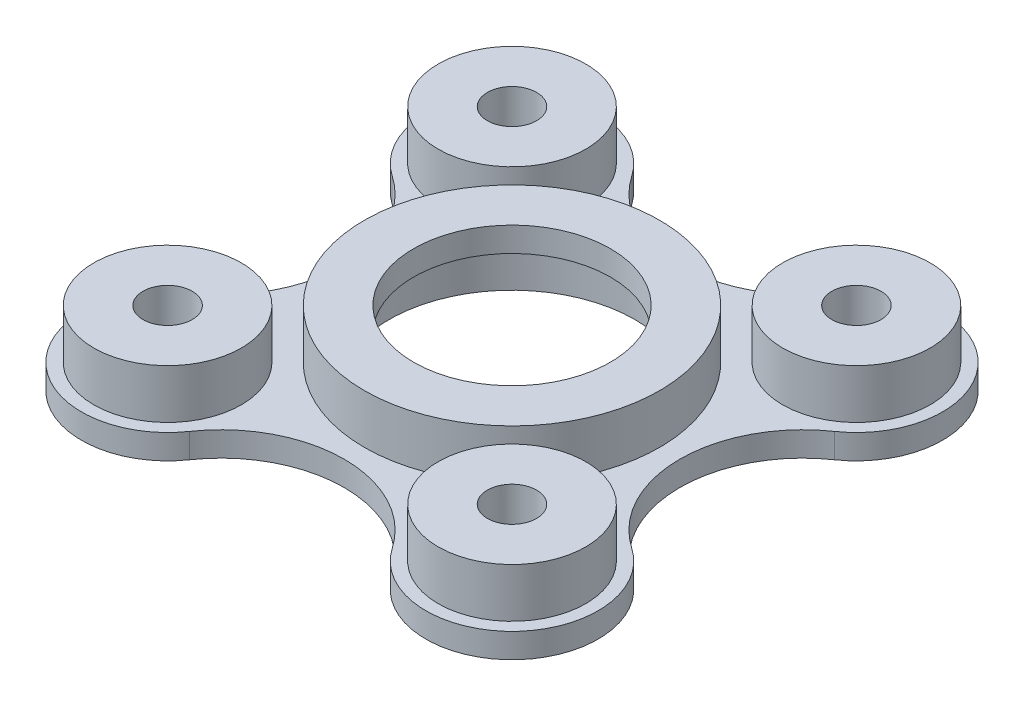
ISO-10303-21;
HEADER;
FILE_DESCRIPTION(('STEP AP214'),'2;1');
FILE_NAME('part.step','',(''),(''),'','','');
FILE_SCHEMA(('AUTOMOTIVE_DESIGN { 1 0 10303 214 1 1 1 1 }'));
ENDSEC;
DATA;
#1=APPLICATION_CONTEXT('core data for automotive mechanical design processes');
#2=APPLICATION_PROTOCOL_DEFINITION('international standard','automotive_design',2000,#1);
#3=PRODUCT_CONTEXT('',#1,'mechanical');
#4=PRODUCT('Part','Part','',(#3));
#5=PRODUCT_RELATED_PRODUCT_CATEGORY('part','',(#4));
#6=PRODUCT_DEFINITION_FORMATION('','',#4);
#7=PRODUCT_DEFINITION_CONTEXT('part definition',#1,'design');
#8=PRODUCT_DEFINITION('design','',#6,#7);
#9=PRODUCT_DEFINITION_SHAPE('','',#8);
#10=(LENGTH_UNIT() NAMED_UNIT(*) SI_UNIT(.MILLI.,.METRE.));
#11=(NAMED_UNIT(*) PLANE_ANGLE_UNIT() SI_UNIT($,.RADIAN.));
#12=(NAMED_UNIT(*) SI_UNIT($,.STERADIAN.) SOLID_ANGLE_UNIT());
#13=UNCERTAINTY_MEASURE_WITH_UNIT(LENGTH_MEASURE(1.E-05),#10,'distance_accuracy_value','');
#14=(GEOMETRIC_REPRESENTATION_CONTEXT(3) GLOBAL_UNCERTAINTY_ASSIGNED_CONTEXT((#13)) GLOBAL_UNIT_ASSIGNED_CONTEXT((#10,
#11,#12)) REPRESENTATION_CONTEXT('',''));
#15=CARTESIAN_POINT('',(0.,0.,0.));
#16=DIRECTION('',(0.,0.,1.));
#17=DIRECTION('',(1.,0.,0.));
#18=AXIS2_PLACEMENT_3D('',#15,#16,#17);
#19=CARTESIAN_POINT('',(0.,1.,0.));
#20=DIRECTION('',(0.,1.,0.));
#21=DIRECTION('',(0.,0.,1.));
#22=AXIS2_PLACEMENT_3D('',#19,#20,#21);
#23=PLANE('',#22);
#24=CARTESIAN_POINT('',(7.00000000000045,1.,6.99999999999936));
#25=DIRECTION('',(0.,1.,0.));
#26=DIRECTION('',(0.,0.,1.));
#27=AXIS2_PLACEMENT_3D('',#24,#25,#26);
#28=CIRCLE('',#27,3.);
#29=CARTESIAN_POINT('',(7.00000000000045,1.,9.99999999999936));
#30=VERTEX_POINT('',#29);
#31=EDGE_CURVE('E229',#30,#30,#28,.T.);
#32=ORIENTED_EDGE('',*,*,#31,.F.);
#33=EDGE_LOOP('',(#32));
#34=FACE_BOUND('',#33,.T.);
#35=CARTESIAN_POINT('',(-7.,1.,-7.00000000000002));
#36=DIRECTION('',(0.,1.,0.));
#37=DIRECTION('',(0.,0.,1.));
#38=AXIS2_PLACEMENT_3D('',#35,#36,#37);
#39=CIRCLE('',#38,3.);
#40=CARTESIAN_POINT('',(-7.,1.,-4.00000000000002));
#41=VERTEX_POINT('',#40);
#42=EDGE_CURVE('E217',#41,#41,#39,.T.);
#43=ORIENTED_EDGE('',*,*,#42,.F.);
#44=EDGE_LOOP('',(#43));
#45=FACE_BOUND('',#44,.T.);
#46=CARTESIAN_POINT('',(11.8218253804959,1.,-3.27701990622173E-13));
#47=DIRECTION('',(0.,1.,0.));
#48=DIRECTION('',(0.,0.,1.));
#49=AXIS2_PLACEMENT_3D('',#46,#47,#48);
#50=CIRCLE('',#49,4.99999999999962);
#51=CARTESIAN_POINT('',(8.98545750961605,1.,-4.1176470588239));
#52=VERTEX_POINT('',#51);
#53=CARTESIAN_POINT('',(8.98545750961618,1.,4.11764705882295));
#54=VERTEX_POINT('',#53);
#55=EDGE_CURVE('E166',#52,#54,#50,.T.);
#56=ORIENTED_EDGE('',*,*,#55,.F.);
#57=CARTESIAN_POINT('',(6.99999999999996,1.,-7.00000000000051));
#58=DIRECTION('',(0.,1.,0.));
#59=DIRECTION('',(0.,0.,1.));
#60=AXIS2_PLACEMENT_3D('',#57,#58,#59);
#61=CIRCLE('',#60,3.50000000000006);
#62=CARTESIAN_POINT('',(4.11764705882321,1.,-8.9854575096164));
#63=VERTEX_POINT('',#62);
#64=EDGE_CURVE('E194',#52,#63,#61,.T.);
#65=ORIENTED_EDGE('',*,*,#64,.T.);
#66=CARTESIAN_POINT('',(-1.16403269125734E-13,1.,-11.821825380496));
#67=DIRECTION('',(0.,1.,0.));
#68=DIRECTION('',(0.,0.,1.));
#69=AXIS2_PLACEMENT_3D('',#66,#67,#68);
#70=CIRCLE('',#69,4.99999999999949);
#71=CARTESIAN_POINT('',(-4.11764705882334,1.,-8.98545750961605));
#72=VERTEX_POINT('',#71);
#73=EDGE_CURVE('E179',#72,#63,#70,.T.);
#74=ORIENTED_EDGE('',*,*,#73,.F.);
#75=CARTESIAN_POINT('',(-7.,1.,-7.00000000000002));
#76=DIRECTION('',(0.,1.,0.));
#77=DIRECTION('',(0.,0.,1.));
#78=AXIS2_PLACEMENT_3D('',#75,#76,#77);
#79=CIRCLE('',#78,3.50000000000006);
#80=CARTESIAN_POINT('',(-8.98545750961589,1.,-4.11764705882327));
#81=VERTEX_POINT('',#80);
#82=EDGE_CURVE('E192',#72,#81,#79,.T.);
#83=ORIENTED_EDGE('',*,*,#82,.T.);
#84=CARTESIAN_POINT('',(-11.8218253804954,1.,1.25893673085622E-13));
#85=DIRECTION('',(0.,1.,0.));
#86=DIRECTION('',(0.,0.,1.));
#87=AXIS2_PLACEMENT_3D('',#84,#85,#86);
#88=CIRCLE('',#87,4.99999999999941);
#89=CARTESIAN_POINT('',(-8.98545750961566,1.,4.11764705882323));
#90=VERTEX_POINT('',#89);
#91=EDGE_CURVE('E112',#90,#81,#88,.T.);
#92=ORIENTED_EDGE('',*,*,#91,.F.);
#93=CARTESIAN_POINT('',(-6.99999999999951,1.,6.99999999999994));
#94=DIRECTION('',(0.,1.,0.));
#95=DIRECTION('',(0.,0.,1.));
#96=AXIS2_PLACEMENT_3D('',#93,#94,#95);
#97=CIRCLE('',#96,3.50000000000017);
#98=CARTESIAN_POINT('',(-4.11764705882275,1.,8.985457509616));
#99=VERTEX_POINT('',#98);
#100=EDGE_CURVE('E106',#90,#99,#97,.T.);
#101=ORIENTED_EDGE('',*,*,#100,.T.);
#102=CARTESIAN_POINT('',(5.10229450965904E-13,1.,11.8218253804956));
#103=DIRECTION('',(0.,1.,0.));
#104=DIRECTION('',(0.,0.,1.));
#105=AXIS2_PLACEMENT_3D('',#102,#103,#104);
#106=CIRCLE('',#105,4.99999999999951);
#107=CARTESIAN_POINT('',(4.11764705882381,1.,8.98545750961555));
#108=VERTEX_POINT('',#107);
#109=EDGE_CURVE('E110',#108,#99,#106,.T.);
#110=ORIENTED_EDGE('',*,*,#109,.F.);
#111=CARTESIAN_POINT('',(7.00000000000039,1.,6.99999999999963));
#112=DIRECTION('',(0.,1.,0.));
#113=DIRECTION('',(0.,0.,1.));
#114=AXIS2_PLACEMENT_3D('',#111,#112,#113);
#115=CIRCLE('',#114,3.49999999999994);
#116=EDGE_CURVE('E53',#108,#54,#115,.T.);
#117=ORIENTED_EDGE('',*,*,#116,.T.);
#118=EDGE_LOOP('',(#56,#65,#74,#83,#92,#101,#110,#117));
#119=FACE_BOUND('',#118,.T.);
#120=CARTESIAN_POINT('',(0.,1.,0.));
#121=DIRECTION('',(0.,1.,0.));
#122=DIRECTION('',(0.,0.,1.));
#123=AXIS2_PLACEMENT_3D('',#120,#121,#122);
#124=CIRCLE('',#123,6.);
#125=CARTESIAN_POINT('',(0.,1.,6.));
#126=VERTEX_POINT('',#125);
#127=EDGE_CURVE('E202',#126,#126,#124,.T.);
#128=ORIENTED_EDGE('',*,*,#127,.F.);
#129=EDGE_LOOP('',(#128));
#130=FACE_BOUND('',#129,.T.);
#131=CARTESIAN_POINT('',(7.00000000000002,1.,-7.0000000000006));
#132=DIRECTION('',(0.,1.,0.));
#133=DIRECTION('',(0.,0.,1.));
#134=AXIS2_PLACEMENT_3D('',#131,#132,#133);
#135=CIRCLE('',#134,3.);
#136=CARTESIAN_POINT('',(7.00000000000002,1.,-4.0000000000006));
#137=VERTEX_POINT('',#136);
#138=EDGE_CURVE('E223',#137,#137,#135,.T.);
#139=ORIENTED_EDGE('',*,*,#138,.F.);
#140=EDGE_LOOP('',(#139));
#141=FACE_BOUND('',#140,.T.);
#142=CARTESIAN_POINT('',(-6.99999999999957,1.,6.99999999999994));
#143=DIRECTION('',(0.,1.,0.));
#144=DIRECTION('',(0.,0.,1.));
#145=AXIS2_PLACEMENT_3D('',#142,#143,#144);
#146=CIRCLE('',#145,3.);
#147=CARTESIAN_POINT('',(-6.99999999999957,1.,9.99999999999994));
#148=VERTEX_POINT('',#147);
#149=EDGE_CURVE('E235',#148,#148,#146,.T.);
#150=ORIENTED_EDGE('',*,*,#149,.F.);
#151=EDGE_LOOP('',(#150));
#152=FACE_BOUND('',#151,.T.);
#153=ADVANCED_FACE('F36',(#34,#45,#119,#130,#141,#152),#23,.T.);
#154=CARTESIAN_POINT('',(11.8218253804959,1.,-3.27701990622173E-13));
#155=DIRECTION('',(0.,-1.,0.));
#156=DIRECTION('',(0.,0.,-1.));
#157=AXIS2_PLACEMENT_3D('',#154,#155,#156);
#158=CYLINDRICAL_SURFACE('',#157,4.99999999999962);
#159=CARTESIAN_POINT('',(11.8218253804959,0.,-3.27701990622173E-13));
#160=DIRECTION('',(0.,1.,0.));
#161=DIRECTION('',(0.,0.,1.));
#162=AXIS2_PLACEMENT_3D('',#159,#160,#161);
#163=CIRCLE('',#162,4.99999999999962);
#164=CARTESIAN_POINT('',(8.98545750961605,0.,-4.1176470588239));
#165=VERTEX_POINT('',#164);
#166=CARTESIAN_POINT('',(8.98545750961618,0.,4.11764705882295));
#167=VERTEX_POINT('',#166);
#168=EDGE_CURVE('E130',#165,#167,#163,.T.);
#169=ORIENTED_EDGE('',*,*,#168,.F.);
#170=DIRECTION('',(0.,-1.,0.));
#171=VECTOR('',#170,1.);
#172=CARTESIAN_POINT('',(8.98545750961605,1.,-4.1176470588239));
#173=LINE('',#172,#171);
#174=EDGE_CURVE('E11',#52,#165,#173,.T.);
#175=ORIENTED_EDGE('',*,*,#174,.F.);
#176=ORIENTED_EDGE('',*,*,#55,.T.);
#177=DIRECTION('',(0.,-1.,0.));
#178=VECTOR('',#177,1.);
#179=CARTESIAN_POINT('',(8.98545750961618,1.,4.11764705882295));
#180=LINE('',#179,#178);
#181=EDGE_CURVE('E87',#54,#167,#180,.T.);
#182=ORIENTED_EDGE('',*,*,#181,.T.);
#183=EDGE_LOOP('',(#169,#175,#176,#182));
#184=FACE_BOUND('',#183,.T.);
#185=ADVANCED_FACE('F38',(#184),#158,.F.);
#186=CARTESIAN_POINT('',(6.99999999999996,1.,-7.00000000000051));
#187=DIRECTION('',(0.,-1.,0.));
#188=DIRECTION('',(0.,0.,-1.));
#189=AXIS2_PLACEMENT_3D('',#186,#187,#188);
#190=CYLINDRICAL_SURFACE('',#189,3.50000000000006);
#191=CARTESIAN_POINT('',(6.99999999999996,0.,-7.00000000000051));
#192=DIRECTION('',(0.,1.,0.));
#193=DIRECTION('',(0.,0.,1.));
#194=AXIS2_PLACEMENT_3D('',#191,#192,#193);
#195=CIRCLE('',#194,3.50000000000006);
#196=CARTESIAN_POINT('',(4.11764705882321,0.,-8.9854575096164));
#197=VERTEX_POINT('',#196);
#198=EDGE_CURVE('E133',#165,#197,#195,.T.);
#199=ORIENTED_EDGE('',*,*,#198,.T.);
#200=DIRECTION('',(0.,-1.,0.));
#201=VECTOR('',#200,1.);
#202=CARTESIAN_POINT('',(4.11764705882321,1.,-8.9854575096164));
#203=LINE('',#202,#201);
#204=EDGE_CURVE('E45',#63,#197,#203,.T.);
#205=ORIENTED_EDGE('',*,*,#204,.F.);
#206=ORIENTED_EDGE('',*,*,#64,.F.);
#207=ORIENTED_EDGE('',*,*,#174,.T.);
#208=EDGE_LOOP('',(#199,#205,#206,#207));
#209=FACE_BOUND('',#208,.T.);
#210=ADVANCED_FACE('F182',(#209),#190,.T.);
#211=CARTESIAN_POINT('',(-1.16403269125734E-13,1.,-11.821825380496));
#212=DIRECTION('',(0.,-1.,0.));
#213=DIRECTION('',(0.,0.,-1.));
#214=AXIS2_PLACEMENT_3D('',#211,#212,#213);
#215=CYLINDRICAL_SURFACE('',#214,4.99999999999949);
#216=CARTESIAN_POINT('',(-1.16403269125734E-13,0.,-11.821825380496));
#217=DIRECTION('',(0.,1.,0.));
#218=DIRECTION('',(0.,0.,1.));
#219=AXIS2_PLACEMENT_3D('',#216,#217,#218);
#220=CIRCLE('',#219,4.99999999999949);
#221=CARTESIAN_POINT('',(-4.11764705882334,0.,-8.98545750961605));
#222=VERTEX_POINT('',#221);
#223=EDGE_CURVE('E137',#222,#197,#220,.T.);
#224=ORIENTED_EDGE('',*,*,#223,.F.);
#225=DIRECTION('',(0.,-1.,0.));
#226=VECTOR('',#225,1.);
#227=CARTESIAN_POINT('',(-4.11764705882334,1.,-8.98545750961605));
#228=LINE('',#227,#226);
#229=EDGE_CURVE('E172',#72,#222,#228,.T.);
#230=ORIENTED_EDGE('',*,*,#229,.F.);
#231=ORIENTED_EDGE('',*,*,#73,.T.);
#232=ORIENTED_EDGE('',*,*,#204,.T.);
#233=EDGE_LOOP('',(#224,#230,#231,#232));
#234=FACE_BOUND('',#233,.T.);
#235=ADVANCED_FACE('F177',(#234),#215,.F.);
#236=CARTESIAN_POINT('',(-7.,1.,-7.00000000000002));
#237=DIRECTION('',(0.,-1.,0.));
#238=DIRECTION('',(0.,0.,-1.));
#239=AXIS2_PLACEMENT_3D('',#236,#237,#238);
#240=CYLINDRICAL_SURFACE('',#239,3.50000000000006);
#241=CARTESIAN_POINT('',(-7.,0.,-7.00000000000002));
#242=DIRECTION('',(0.,1.,0.));
#243=DIRECTION('',(0.,0.,1.));
#244=AXIS2_PLACEMENT_3D('',#241,#242,#243);
#245=CIRCLE('',#244,3.50000000000006);
#246=CARTESIAN_POINT('',(-8.98545750961589,0.,-4.11764705882327));
#247=VERTEX_POINT('',#246);
#248=EDGE_CURVE('E140',#222,#247,#245,.T.);
#249=ORIENTED_EDGE('',*,*,#248,.T.);
#250=DIRECTION('',(0.,-1.,0.));
#251=VECTOR('',#250,1.);
#252=CARTESIAN_POINT('',(-8.98545750961589,1.,-4.11764705882327));
#253=LINE('',#252,#251);
#254=EDGE_CURVE('E170',#81,#247,#253,.T.);
#255=ORIENTED_EDGE('',*,*,#254,.F.);
#256=ORIENTED_EDGE('',*,*,#82,.F.);
#257=ORIENTED_EDGE('',*,*,#229,.T.);
#258=EDGE_LOOP('',(#249,#255,#256,#257));
#259=FACE_BOUND('',#258,.T.);
#260=ADVANCED_FACE('F190',(#259),#240,.T.);
#261=CARTESIAN_POINT('',(-11.8218253804954,1.,1.25893673085622E-13));
#262=DIRECTION('',(0.,-1.,0.));
#263=DIRECTION('',(0.,0.,-1.));
#264=AXIS2_PLACEMENT_3D('',#261,#262,#263);
#265=CYLINDRICAL_SURFACE('',#264,4.99999999999941);
#266=CARTESIAN_POINT('',(-11.8218253804954,0.,1.25893673085622E-13));
#267=DIRECTION('',(0.,1.,0.));
#268=DIRECTION('',(0.,0.,1.));
#269=AXIS2_PLACEMENT_3D('',#266,#267,#268);
#270=CIRCLE('',#269,4.99999999999941);
#271=CARTESIAN_POINT('',(-8.98545750961566,0.,4.11764705882323));
#272=VERTEX_POINT('',#271);
#273=EDGE_CURVE('E143',#272,#247,#270,.T.);
#274=ORIENTED_EDGE('',*,*,#273,.F.);
#275=DIRECTION('',(0.,-1.,0.));
#276=VECTOR('',#275,1.);
#277=CARTESIAN_POINT('',(-8.98545750961566,1.,4.11764705882323));
#278=LINE('',#277,#276);
#279=EDGE_CURVE('E123',#90,#272,#278,.T.);
#280=ORIENTED_EDGE('',*,*,#279,.F.);
#281=ORIENTED_EDGE('',*,*,#91,.T.);
#282=ORIENTED_EDGE('',*,*,#254,.T.);
#283=EDGE_LOOP('',(#274,#280,#281,#282));
#284=FACE_BOUND('',#283,.T.);
#285=ADVANCED_FACE('F199',(#284),#265,.F.);
#286=CARTESIAN_POINT('',(-6.99999999999951,1.,6.99999999999994));
#287=DIRECTION('',(0.,-1.,0.));
#288=DIRECTION('',(0.,0.,-1.));
#289=AXIS2_PLACEMENT_3D('',#286,#287,#288);
#290=CYLINDRICAL_SURFACE('',#289,3.50000000000017);
#291=CARTESIAN_POINT('',(-6.99999999999951,0.,6.99999999999994));
#292=DIRECTION('',(0.,1.,0.));
#293=DIRECTION('',(0.,0.,1.));
#294=AXIS2_PLACEMENT_3D('',#291,#292,#293);
#295=CIRCLE('',#294,3.50000000000017);
#296=CARTESIAN_POINT('',(-4.11764705882275,0.,8.985457509616));
#297=VERTEX_POINT('',#296);
#298=EDGE_CURVE('E119',#272,#297,#295,.T.);
#299=ORIENTED_EDGE('',*,*,#298,.T.);
#300=DIRECTION('',(0.,-1.,0.));
#301=VECTOR('',#300,1.);
#302=CARTESIAN_POINT('',(-4.11764705882275,1.,8.985457509616));
#303=LINE('',#302,#301);
#304=EDGE_CURVE('E116',#99,#297,#303,.T.);
#305=ORIENTED_EDGE('',*,*,#304,.F.);
#306=ORIENTED_EDGE('',*,*,#100,.F.);
#307=ORIENTED_EDGE('',*,*,#279,.T.);
#308=EDGE_LOOP('',(#299,#305,#306,#307));
#309=FACE_BOUND('',#308,.T.);
#310=ADVANCED_FACE('F117',(#309),#290,.T.);
#311=CARTESIAN_POINT('',(5.10229450965904E-13,1.,11.8218253804956));
#312=DIRECTION('',(0.,-1.,0.));
#313=DIRECTION('',(0.,0.,-1.));
#314=AXIS2_PLACEMENT_3D('',#311,#312,#313);
#315=CYLINDRICAL_SURFACE('',#314,4.99999999999951);
#316=CARTESIAN_POINT('',(5.10229450965904E-13,0.,11.8218253804956));
#317=DIRECTION('',(0.,1.,0.));
#318=DIRECTION('',(0.,0.,1.));
#319=AXIS2_PLACEMENT_3D('',#316,#317,#318);
#320=CIRCLE('',#319,4.99999999999951);
#321=CARTESIAN_POINT('',(4.11764705882381,0.,8.98545750961555));
#322=VERTEX_POINT('',#321);
#323=EDGE_CURVE('E147',#322,#297,#320,.T.);
#324=ORIENTED_EDGE('',*,*,#323,.F.);
#325=DIRECTION('',(0.,-1.,0.));
#326=VECTOR('',#325,1.);
#327=CARTESIAN_POINT('',(4.11764705882381,1.,8.98545750961555));
#328=LINE('',#327,#326);
#329=EDGE_CURVE('E80',#108,#322,#328,.T.);
#330=ORIENTED_EDGE('',*,*,#329,.F.);
#331=ORIENTED_EDGE('',*,*,#109,.T.);
#332=ORIENTED_EDGE('',*,*,#304,.T.);
#333=EDGE_LOOP('',(#324,#330,#331,#332));
#334=FACE_BOUND('',#333,.T.);
#335=ADVANCED_FACE('F125',(#334),#315,.F.);
#336=CARTESIAN_POINT('',(-7.,1.,-7.00000000000002));
#337=DIRECTION('',(0.,-1.,0.));
#338=DIRECTION('',(0.,0.,-1.));
#339=AXIS2_PLACEMENT_3D('',#336,#337,#338);
#340=CYLINDRICAL_SURFACE('',#339,0.999999999999998);
#341=CARTESIAN_POINT('',(-7.,0.,-7.00000000000002));
#342=DIRECTION('',(0.,1.,0.));
#343=DIRECTION('',(0.,0.,1.));
#344=AXIS2_PLACEMENT_3D('',#341,#342,#343);
#345=CIRCLE('',#344,0.999999999999998);
#346=CARTESIAN_POINT('',(-7.,0.,-6.00000000000002));
#347=VERTEX_POINT('',#346);
#348=EDGE_CURVE('E160',#347,#347,#345,.T.);
#349=ORIENTED_EDGE('',*,*,#348,.F.);
#350=EDGE_LOOP('',(#349));
#351=FACE_BOUND('',#350,.T.);
#352=CARTESIAN_POINT('',(-7.,3.,-7.00000000000002));
#353=DIRECTION('',(0.,-1.,0.));
#354=DIRECTION('',(0.,0.,-1.));
#355=AXIS2_PLACEMENT_3D('',#352,#353,#354);
#356=CIRCLE('',#355,1.);
#357=CARTESIAN_POINT('',(-7.,3.,-8.00000000000002));
#358=VERTEX_POINT('',#357);
#359=EDGE_CURVE('E249',#358,#358,#356,.T.);
#360=ORIENTED_EDGE('',*,*,#359,.F.);
#361=EDGE_LOOP('',(#360));
#362=FACE_BOUND('',#361,.T.);
#363=ADVANCED_FACE('F256',(#351,#362),#340,.F.);
#364=CARTESIAN_POINT('',(7.00000000000002,1.,-7.0000000000006));
#365=DIRECTION('',(0.,-1.,0.));
#366=DIRECTION('',(0.,0.,-1.));
#367=AXIS2_PLACEMENT_3D('',#364,#365,#366);
#368=CYLINDRICAL_SURFACE('',#367,1.);
#369=CARTESIAN_POINT('',(7.00000000000002,0.,-7.0000000000006));
#370=DIRECTION('',(0.,1.,0.));
#371=DIRECTION('',(0.,0.,1.));
#372=AXIS2_PLACEMENT_3D('',#369,#370,#371);
#373=CIRCLE('',#372,1.);
#374=CARTESIAN_POINT('',(7.00000000000002,0.,-6.0000000000006));
#375=VERTEX_POINT('',#374);
#376=EDGE_CURVE('E157',#375,#375,#373,.T.);
#377=ORIENTED_EDGE('',*,*,#376,.F.);
#378=EDGE_LOOP('',(#377));
#379=FACE_BOUND('',#378,.T.);
#380=CARTESIAN_POINT('',(7.00000000000002,3.,-7.00000000000061));
#381=DIRECTION('',(0.,-1.,0.));
#382=DIRECTION('',(0.,0.,-1.));
#383=AXIS2_PLACEMENT_3D('',#380,#381,#382);
#384=CIRCLE('',#383,1.);
#385=CARTESIAN_POINT('',(7.00000000000002,3.,-8.00000000000061));
#386=VERTEX_POINT('',#385);
#387=EDGE_CURVE('E246',#386,#386,#384,.T.);
#388=ORIENTED_EDGE('',*,*,#387,.F.);
#389=EDGE_LOOP('',(#388));
#390=FACE_BOUND('',#389,.T.);
#391=ADVANCED_FACE('F258',(#379,#390),#368,.F.);
#392=CARTESIAN_POINT('',(7.0000000000006,1.,6.99999999999942));
#393=DIRECTION('',(0.,-1.,0.));
#394=DIRECTION('',(0.,0.,-1.));
#395=AXIS2_PLACEMENT_3D('',#392,#393,#394);
#396=CYLINDRICAL_SURFACE('',#395,1.);
#397=CARTESIAN_POINT('',(7.0000000000006,0.,6.99999999999942));
#398=DIRECTION('',(0.,1.,0.));
#399=DIRECTION('',(0.,0.,1.));
#400=AXIS2_PLACEMENT_3D('',#397,#398,#399);
#401=CIRCLE('',#400,1.);
#402=CARTESIAN_POINT('',(7.0000000000006,0.,7.99999999999942));
#403=VERTEX_POINT('',#402);
#404=EDGE_CURVE('E154',#403,#403,#401,.T.);
#405=ORIENTED_EDGE('',*,*,#404,.F.);
#406=EDGE_LOOP('',(#405));
#407=FACE_BOUND('',#406,.T.);
#408=CARTESIAN_POINT('',(7.0000000000006,3.,6.99999999999942));
#409=DIRECTION('',(0.,-1.,0.));
#410=DIRECTION('',(0.,0.,-1.));
#411=AXIS2_PLACEMENT_3D('',#408,#409,#410);
#412=CIRCLE('',#411,1.);
#413=CARTESIAN_POINT('',(7.0000000000006,3.,5.99999999999941));
#414=VERTEX_POINT('',#413);
#415=EDGE_CURVE('E243',#414,#414,#412,.T.);
#416=ORIENTED_EDGE('',*,*,#415,.F.);
#417=EDGE_LOOP('',(#416));
#418=FACE_BOUND('',#417,.T.);
#419=ADVANCED_FACE('F265',(#407,#418),#396,.F.);
#420=CARTESIAN_POINT('',(-6.99999999999942,1.,7.));
#421=DIRECTION('',(0.,-1.,0.));
#422=DIRECTION('',(0.,0.,-1.));
#423=AXIS2_PLACEMENT_3D('',#420,#421,#422);
#424=CYLINDRICAL_SURFACE('',#423,1.);
#425=CARTESIAN_POINT('',(-6.99999999999942,0.,7.));
#426=DIRECTION('',(0.,1.,0.));
#427=DIRECTION('',(0.,0.,1.));
#428=AXIS2_PLACEMENT_3D('',#425,#426,#427);
#429=CIRCLE('',#428,1.);
#430=CARTESIAN_POINT('',(-6.99999999999942,0.,8.));
#431=VERTEX_POINT('',#430);
#432=EDGE_CURVE('E151',#431,#431,#429,.T.);
#433=ORIENTED_EDGE('',*,*,#432,.F.);
#434=EDGE_LOOP('',(#433));
#435=FACE_BOUND('',#434,.T.);
#436=CARTESIAN_POINT('',(-6.99999999999942,3.,7.));
#437=DIRECTION('',(0.,-1.,0.));
#438=DIRECTION('',(0.,0.,-1.));
#439=AXIS2_PLACEMENT_3D('',#436,#437,#438);
#440=CIRCLE('',#439,1.);
#441=CARTESIAN_POINT('',(-6.99999999999942,3.,6.));
#442=VERTEX_POINT('',#441);
#443=EDGE_CURVE('E238',#442,#442,#440,.T.);
#444=ORIENTED_EDGE('',*,*,#443,.F.);
#445=EDGE_LOOP('',(#444));
#446=FACE_BOUND('',#445,.T.);
#447=ADVANCED_FACE('F291',(#435,#446),#424,.F.);
#448=CARTESIAN_POINT('',(7.00000000000039,1.,6.99999999999963));
#449=DIRECTION('',(0.,-1.,0.));
#450=DIRECTION('',(0.,0.,-1.));
#451=AXIS2_PLACEMENT_3D('',#448,#449,#450);
#452=CYLINDRICAL_SURFACE('',#451,3.49999999999994);
#453=CARTESIAN_POINT('',(7.00000000000039,0.,6.99999999999963));
#454=DIRECTION('',(0.,1.,0.));
#455=DIRECTION('',(0.,0.,1.));
#456=AXIS2_PLACEMENT_3D('',#453,#454,#455);
#457=CIRCLE('',#456,3.49999999999994);
#458=EDGE_CURVE('E149',#322,#167,#457,.T.);
#459=ORIENTED_EDGE('',*,*,#458,.T.);
#460=ORIENTED_EDGE('',*,*,#181,.F.);
#461=ORIENTED_EDGE('',*,*,#116,.F.);
#462=ORIENTED_EDGE('',*,*,#329,.T.);
#463=EDGE_LOOP('',(#459,#460,#461,#462));
#464=FACE_BOUND('',#463,.T.);
#465=ADVANCED_FACE('F200',(#464),#452,.T.);
#466=CARTESIAN_POINT('',(0.,1.,0.));
#467=DIRECTION('',(0.,-1.,0.));
#468=DIRECTION('',(0.,0.,-1.));
#469=AXIS2_PLACEMENT_3D('',#466,#467,#468);
#470=CYLINDRICAL_SURFACE('',#469,5.);
#471=CARTESIAN_POINT('',(0.,0.,0.));
#472=DIRECTION('',(0.,1.,0.));
#473=DIRECTION('',(0.,0.,1.));
#474=AXIS2_PLACEMENT_3D('',#471,#472,#473);
#475=CIRCLE('',#474,5.);
#476=CARTESIAN_POINT('',(0.,0.,5.));
#477=VERTEX_POINT('',#476);
#478=EDGE_CURVE('E163',#477,#477,#475,.T.);
#479=ORIENTED_EDGE('',*,*,#478,.F.);
#480=EDGE_LOOP('',(#479));
#481=FACE_BOUND('',#480,.T.);
#482=CARTESIAN_POINT('',(0.,2.,0.));
#483=DIRECTION('',(0.,-1.,0.));
#484=DIRECTION('',(0.,0.,-1.));
#485=AXIS2_PLACEMENT_3D('',#482,#483,#484);
#486=CIRCLE('',#485,5.);
#487=CARTESIAN_POINT('',(0.,2.,-5.));
#488=VERTEX_POINT('',#487);
#489=EDGE_CURVE('E205',#488,#488,#486,.T.);
#490=ORIENTED_EDGE('',*,*,#489,.F.);
#491=EDGE_LOOP('',(#490));
#492=FACE_BOUND('',#491,.T.);
#493=ADVANCED_FACE('F285',(#481,#492),#470,.F.);
#494=CARTESIAN_POINT('',(0.,0.,0.));
#495=DIRECTION('',(0.,1.,0.));
#496=DIRECTION('',(0.,0.,1.));
#497=AXIS2_PLACEMENT_3D('',#494,#495,#496);
#498=PLANE('',#497);
#499=ORIENTED_EDGE('',*,*,#168,.T.);
#500=ORIENTED_EDGE('',*,*,#458,.F.);
#501=ORIENTED_EDGE('',*,*,#323,.T.);
#502=ORIENTED_EDGE('',*,*,#298,.F.);
#503=ORIENTED_EDGE('',*,*,#273,.T.);
#504=ORIENTED_EDGE('',*,*,#248,.F.);
#505=ORIENTED_EDGE('',*,*,#223,.T.);
#506=ORIENTED_EDGE('',*,*,#198,.F.);
#507=EDGE_LOOP('',(#499,#500,#501,#502,#503,#504,#505,#506));
#508=FACE_BOUND('',#507,.T.);
#509=ORIENTED_EDGE('',*,*,#432,.T.);
#510=EDGE_LOOP('',(#509));
#511=FACE_BOUND('',#510,.T.);
#512=ORIENTED_EDGE('',*,*,#404,.T.);
#513=EDGE_LOOP('',(#512));
#514=FACE_BOUND('',#513,.T.);
#515=ORIENTED_EDGE('',*,*,#376,.T.);
#516=EDGE_LOOP('',(#515));
#517=FACE_BOUND('',#516,.T.);
#518=ORIENTED_EDGE('',*,*,#348,.T.);
#519=EDGE_LOOP('',(#518));
#520=FACE_BOUND('',#519,.T.);
#521=ORIENTED_EDGE('',*,*,#478,.T.);
#522=EDGE_LOOP('',(#521));
#523=FACE_BOUND('',#522,.T.);
#524=ADVANCED_FACE('F185',(#508,#511,#514,#517,#520,#523),#498,.F.);
#525=CARTESIAN_POINT('',(0.,3.,0.));
#526=DIRECTION('',(0.,1.,0.));
#527=DIRECTION('',(0.,0.,1.));
#528=AXIS2_PLACEMENT_3D('',#525,#526,#527);
#529=PLANE('',#528);
#530=CARTESIAN_POINT('',(0.,3.,0.));
#531=DIRECTION('',(0.,-1.,0.));
#532=DIRECTION('',(0.,0.,-1.));
#533=AXIS2_PLACEMENT_3D('',#530,#531,#532);
#534=CIRCLE('',#533,4.);
#535=CARTESIAN_POINT('',(0.,3.,-4.));
#536=VERTEX_POINT('',#535);
#537=EDGE_CURVE('E210',#536,#536,#534,.T.);
#538=ORIENTED_EDGE('',*,*,#537,.T.);
#539=EDGE_LOOP('',(#538));
#540=FACE_BOUND('',#539,.T.);
#541=CARTESIAN_POINT('',(0.,3.,0.));
#542=DIRECTION('',(0.,1.,0.));
#543=DIRECTION('',(0.,0.,1.));
#544=AXIS2_PLACEMENT_3D('',#541,#542,#543);
#545=CIRCLE('',#544,6.);
#546=CARTESIAN_POINT('',(0.,3.,6.));
#547=VERTEX_POINT('',#546);
#548=EDGE_CURVE('E134',#547,#547,#545,.T.);
#549=ORIENTED_EDGE('',*,*,#548,.T.);
#550=EDGE_LOOP('',(#549));
#551=FACE_BOUND('',#550,.T.);
#552=ADVANCED_FACE('F284',(#540,#551),#529,.T.);
#553=CARTESIAN_POINT('',(0.,3.,0.));
#554=DIRECTION('',(0.,-1.,0.));
#555=DIRECTION('',(0.,0.,-1.));
#556=AXIS2_PLACEMENT_3D('',#553,#554,#555);
#557=CYLINDRICAL_SURFACE('',#556,6.);
#558=ORIENTED_EDGE('',*,*,#548,.F.);
#559=EDGE_LOOP('',(#558));
#560=FACE_BOUND('',#559,.T.);
#561=ORIENTED_EDGE('',*,*,#127,.T.);
#562=EDGE_LOOP('',(#561));
#563=FACE_BOUND('',#562,.T.);
#564=ADVANCED_FACE('F281',(#560,#563),#557,.T.);
#565=CARTESIAN_POINT('',(0.,2.,0.));
#566=DIRECTION('',(0.,-1.,0.));
#567=DIRECTION('',(0.,0.,-1.));
#568=AXIS2_PLACEMENT_3D('',#565,#566,#567);
#569=PLANE('',#568);
#570=CARTESIAN_POINT('',(0.,2.,0.));
#571=DIRECTION('',(0.,-1.,0.));
#572=DIRECTION('',(0.,0.,-1.));
#573=AXIS2_PLACEMENT_3D('',#570,#571,#572);
#574=CIRCLE('',#573,4.);
#575=CARTESIAN_POINT('',(0.,2.,-4.));
#576=VERTEX_POINT('',#575);
#577=EDGE_CURVE('E211',#576,#576,#574,.T.);
#578=ORIENTED_EDGE('',*,*,#577,.F.);
#579=EDGE_LOOP('',(#578));
#580=FACE_BOUND('',#579,.T.);
#581=ORIENTED_EDGE('',*,*,#489,.T.);
#582=EDGE_LOOP('',(#581));
#583=FACE_BOUND('',#582,.T.);
#584=ADVANCED_FACE('F297',(#580,#583),#569,.T.);
#585=CARTESIAN_POINT('',(0.,3.,0.));
#586=DIRECTION('',(0.,-1.,0.));
#587=DIRECTION('',(0.,0.,-1.));
#588=AXIS2_PLACEMENT_3D('',#585,#586,#587);
#589=CYLINDRICAL_SURFACE('',#588,4.);
#590=ORIENTED_EDGE('',*,*,#537,.F.);
#591=EDGE_LOOP('',(#590));
#592=FACE_BOUND('',#591,.T.);
#593=ORIENTED_EDGE('',*,*,#577,.T.);
#594=EDGE_LOOP('',(#593));
#595=FACE_BOUND('',#594,.T.);
#596=ADVANCED_FACE('F299',(#592,#595),#589,.F.);
#597=CARTESIAN_POINT('',(-7.,3.,-7.00000000000002));
#598=DIRECTION('',(0.,-1.,0.));
#599=DIRECTION('',(0.,0.,-1.));
#600=AXIS2_PLACEMENT_3D('',#597,#598,#599);
#601=CYLINDRICAL_SURFACE('',#600,3.);
#602=CARTESIAN_POINT('',(-7.,3.,-7.00000000000002));
#603=DIRECTION('',(0.,1.,0.));
#604=DIRECTION('',(0.,0.,1.));
#605=AXIS2_PLACEMENT_3D('',#602,#603,#604);
#606=CIRCLE('',#605,3.);
#607=CARTESIAN_POINT('',(-7.,3.,-4.00000000000002));
#608=VERTEX_POINT('',#607);
#609=EDGE_CURVE('E214',#608,#608,#606,.T.);
#610=ORIENTED_EDGE('',*,*,#609,.F.);
#611=EDGE_LOOP('',(#610));
#612=FACE_BOUND('',#611,.T.);
#613=ORIENTED_EDGE('',*,*,#42,.T.);
#614=EDGE_LOOP('',(#613));
#615=FACE_BOUND('',#614,.T.);
#616=ADVANCED_FACE('F306',(#612,#615),#601,.T.);
#617=CARTESIAN_POINT('',(-7.,3.,-7.00000000000002));
#618=DIRECTION('',(0.,1.,0.));
#619=DIRECTION('',(0.,0.,1.));
#620=AXIS2_PLACEMENT_3D('',#617,#618,#619);
#621=PLANE('',#620);
#622=ORIENTED_EDGE('',*,*,#359,.T.);
#623=EDGE_LOOP('',(#622));
#624=FACE_BOUND('',#623,.T.);
#625=ORIENTED_EDGE('',*,*,#609,.T.);
#626=EDGE_LOOP('',(#625));
#627=FACE_BOUND('',#626,.T.);
#628=ADVANCED_FACE('F253',(#624,#627),#621,.T.);
#629=CARTESIAN_POINT('',(7.00000000000002,3.,-7.0000000000006));
#630=DIRECTION('',(0.,-1.,0.));
#631=DIRECTION('',(0.,0.,-1.));
#632=AXIS2_PLACEMENT_3D('',#629,#630,#631);
#633=CYLINDRICAL_SURFACE('',#632,3.);
#634=CARTESIAN_POINT('',(7.00000000000002,3.,-7.0000000000006));
#635=DIRECTION('',(0.,1.,0.));
#636=DIRECTION('',(0.,0.,1.));
#637=AXIS2_PLACEMENT_3D('',#634,#635,#636);
#638=CIRCLE('',#637,3.);
#639=CARTESIAN_POINT('',(7.00000000000002,3.,-4.0000000000006));
#640=VERTEX_POINT('',#639);
#641=EDGE_CURVE('E220',#640,#640,#638,.T.);
#642=ORIENTED_EDGE('',*,*,#641,.F.);
#643=EDGE_LOOP('',(#642));
#644=FACE_BOUND('',#643,.T.);
#645=ORIENTED_EDGE('',*,*,#138,.T.);
#646=EDGE_LOOP('',(#645));
#647=FACE_BOUND('',#646,.T.);
#648=ADVANCED_FACE('F349',(#644,#647),#633,.T.);
#649=CARTESIAN_POINT('',(7.00000000000002,3.,-7.0000000000006));
#650=DIRECTION('',(0.,1.,0.));
#651=DIRECTION('',(0.,0.,1.));
#652=AXIS2_PLACEMENT_3D('',#649,#650,#651);
#653=PLANE('',#652);
#654=ORIENTED_EDGE('',*,*,#387,.T.);
#655=EDGE_LOOP('',(#654));
#656=FACE_BOUND('',#655,.T.);
#657=ORIENTED_EDGE('',*,*,#641,.T.);
#658=EDGE_LOOP('',(#657));
#659=FACE_BOUND('',#658,.T.);
#660=ADVANCED_FACE('F345',(#656,#659),#653,.T.);
#661=CARTESIAN_POINT('',(7.00000000000045,3.,6.99999999999936));
#662=DIRECTION('',(0.,-1.,0.));
#663=DIRECTION('',(0.,0.,-1.));
#664=AXIS2_PLACEMENT_3D('',#661,#662,#663);
#665=CYLINDRICAL_SURFACE('',#664,3.);
#666=CARTESIAN_POINT('',(7.00000000000045,3.,6.99999999999936));
#667=DIRECTION('',(0.,1.,0.));
#668=DIRECTION('',(0.,0.,1.));
#669=AXIS2_PLACEMENT_3D('',#666,#667,#668);
#670=CIRCLE('',#669,3.);
#671=CARTESIAN_POINT('',(7.00000000000045,3.,9.99999999999936));
#672=VERTEX_POINT('',#671);
#673=EDGE_CURVE('E226',#672,#672,#670,.T.);
#674=ORIENTED_EDGE('',*,*,#673,.F.);
#675=EDGE_LOOP('',(#674));
#676=FACE_BOUND('',#675,.T.);
#677=ORIENTED_EDGE('',*,*,#31,.T.);
#678=EDGE_LOOP('',(#677));
#679=FACE_BOUND('',#678,.T.);
#680=ADVANCED_FACE('F338',(#676,#679),#665,.T.);
#681=CARTESIAN_POINT('',(7.00000000000045,3.,6.99999999999936));
#682=DIRECTION('',(0.,1.,0.));
#683=DIRECTION('',(0.,0.,1.));
#684=AXIS2_PLACEMENT_3D('',#681,#682,#683);
#685=PLANE('',#684);
#686=ORIENTED_EDGE('',*,*,#415,.T.);
#687=EDGE_LOOP('',(#686));
#688=FACE_BOUND('',#687,.T.);
#689=ORIENTED_EDGE('',*,*,#673,.T.);
#690=EDGE_LOOP('',(#689));
#691=FACE_BOUND('',#690,.T.);
#692=ADVANCED_FACE('F329',(#688,#691),#685,.T.);
#693=CARTESIAN_POINT('',(-6.99999999999957,3.,6.99999999999994));
#694=DIRECTION('',(0.,-1.,0.));
#695=DIRECTION('',(0.,0.,-1.));
#696=AXIS2_PLACEMENT_3D('',#693,#694,#695);
#697=CYLINDRICAL_SURFACE('',#696,3.);
#698=CARTESIAN_POINT('',(-6.99999999999957,3.,6.99999999999994));
#699=DIRECTION('',(0.,1.,0.));
#700=DIRECTION('',(0.,0.,1.));
#701=AXIS2_PLACEMENT_3D('',#698,#699,#700);
#702=CIRCLE('',#701,3.);
#703=CARTESIAN_POINT('',(-6.99999999999957,3.,9.99999999999994));
#704=VERTEX_POINT('',#703);
#705=EDGE_CURVE('E232',#704,#704,#702,.T.);
#706=ORIENTED_EDGE('',*,*,#705,.F.);
#707=EDGE_LOOP('',(#706));
#708=FACE_BOUND('',#707,.T.);
#709=ORIENTED_EDGE('',*,*,#149,.T.);
#710=EDGE_LOOP('',(#709));
#711=FACE_BOUND('',#710,.T.);
#712=ADVANCED_FACE('F326',(#708,#711),#697,.T.);
#713=CARTESIAN_POINT('',(-6.99999999999957,3.,6.99999999999994));
#714=DIRECTION('',(0.,1.,0.));
#715=DIRECTION('',(0.,0.,1.));
#716=AXIS2_PLACEMENT_3D('',#713,#714,#715);
#717=PLANE('',#716);
#718=ORIENTED_EDGE('',*,*,#443,.T.);
#719=EDGE_LOOP('',(#718));
#720=FACE_BOUND('',#719,.T.);
#721=ORIENTED_EDGE('',*,*,#705,.T.);
#722=EDGE_LOOP('',(#721));
#723=FACE_BOUND('',#722,.T.);
#724=ADVANCED_FACE('F328',(#720,#723),#717,.T.);
#725=CLOSED_SHELL('',(#153,#185,#210,#235,#260,#285,#310,#335,#363,#391,#419,#447,#465,#493,
#524,#552,#564,#584,#596,#616,#628,#648,#660,#680,#692,#712,#724));
#726=MANIFOLD_SOLID_BREP('B2',#725);
#727=ADVANCED_BREP_SHAPE_REPRESENTATION('',(#18,#726),#14);
#728=SHAPE_DEFINITION_REPRESENTATION(#9,#727);
ENDSEC;
END-ISO-10303-21;
